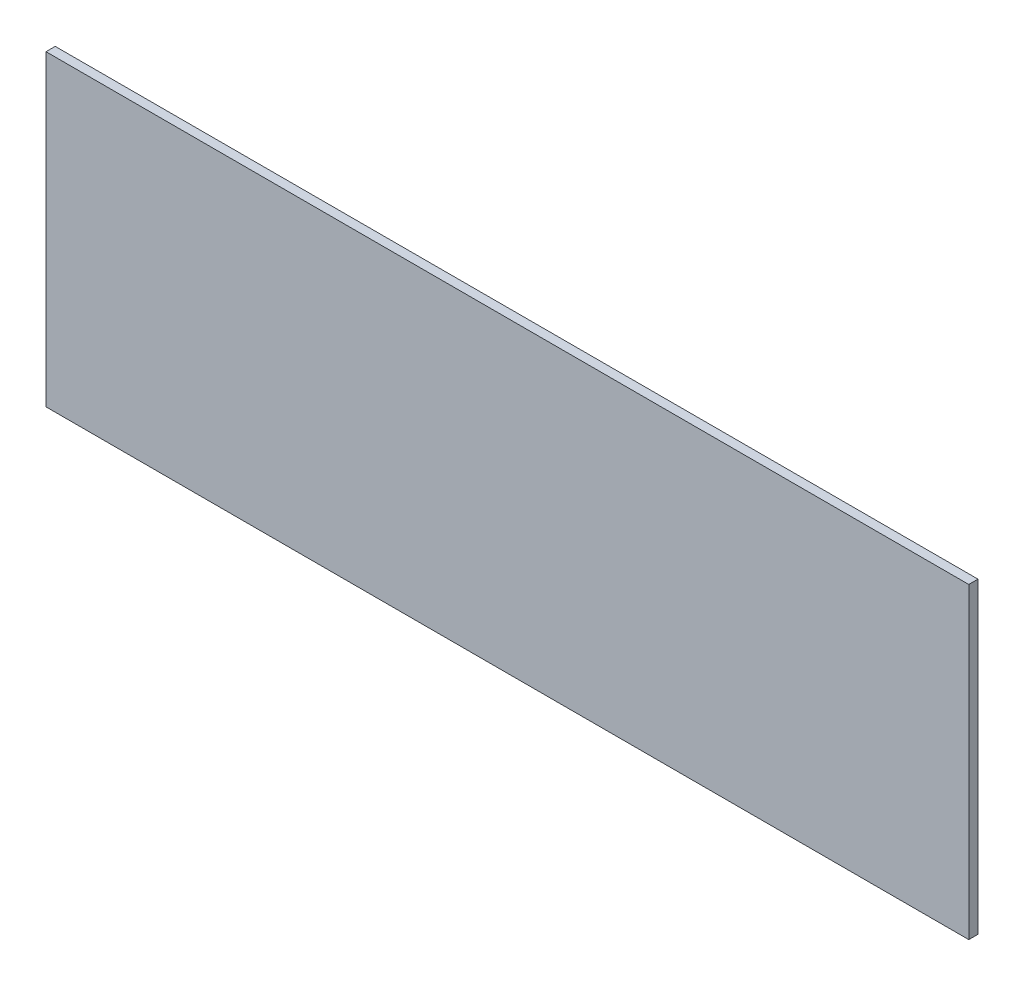
ISO-10303-21;
HEADER;
FILE_DESCRIPTION(('STEP AP214'),'2;1');
FILE_NAME('part.step','',(''),(''),'','','');
FILE_SCHEMA(('AUTOMOTIVE_DESIGN { 1 0 10303 214 1 1 1 1 }'));
ENDSEC;
DATA;
#1=APPLICATION_CONTEXT('core data for automotive mechanical design processes');
#2=APPLICATION_PROTOCOL_DEFINITION('international standard','automotive_design',2000,#1);
#3=PRODUCT_CONTEXT('',#1,'mechanical');
#4=PRODUCT('Part','Part','',(#3));
#5=PRODUCT_RELATED_PRODUCT_CATEGORY('part','',(#4));
#6=PRODUCT_DEFINITION_FORMATION('','',#4);
#7=PRODUCT_DEFINITION_CONTEXT('part definition',#1,'design');
#8=PRODUCT_DEFINITION('design','',#6,#7);
#9=PRODUCT_DEFINITION_SHAPE('','',#8);
#10=(LENGTH_UNIT() NAMED_UNIT(*) SI_UNIT(.MILLI.,.METRE.));
#11=(NAMED_UNIT(*) PLANE_ANGLE_UNIT() SI_UNIT($,.RADIAN.));
#12=(NAMED_UNIT(*) SI_UNIT($,.STERADIAN.) SOLID_ANGLE_UNIT());
#13=UNCERTAINTY_MEASURE_WITH_UNIT(LENGTH_MEASURE(1.E-05),#10,'distance_accuracy_value','');
#14=(GEOMETRIC_REPRESENTATION_CONTEXT(3) GLOBAL_UNCERTAINTY_ASSIGNED_CONTEXT((#13)) GLOBAL_UNIT_ASSIGNED_CONTEXT((#10,
#11,#12)) REPRESENTATION_CONTEXT('',''));
#15=CARTESIAN_POINT('',(0.,0.,0.));
#16=DIRECTION('',(0.,0.,1.));
#17=DIRECTION('',(1.,0.,0.));
#18=AXIS2_PLACEMENT_3D('',#15,#16,#17);
#19=CARTESIAN_POINT('',(0.,0.,3.));
#20=DIRECTION('',(1.,0.,0.));
#21=DIRECTION('',(0.,0.,-1.));
#22=AXIS2_PLACEMENT_3D('',#19,#20,#21);
#23=PLANE('',#22);
#24=DIRECTION('',(0.,-1.,0.));
#25=VECTOR('',#24,1.);
#26=CARTESIAN_POINT('',(0.,0.,0.));
#27=LINE('',#26,#25);
#28=CARTESIAN_POINT('',(0.,100.,0.));
#29=VERTEX_POINT('',#28);
#30=CARTESIAN_POINT('',(0.,0.,0.));
#31=VERTEX_POINT('',#30);
#32=EDGE_CURVE('E102',#29,#31,#27,.T.);
#33=ORIENTED_EDGE('',*,*,#32,.T.);
#34=DIRECTION('',(0.,0.,-1.));
#35=VECTOR('',#34,1.);
#36=CARTESIAN_POINT('',(0.,0.,3.));
#37=LINE('',#36,#35);
#38=CARTESIAN_POINT('',(0.,0.,3.));
#39=VERTEX_POINT('',#38);
#40=EDGE_CURVE('E11',#39,#31,#37,.T.);
#41=ORIENTED_EDGE('',*,*,#40,.F.);
#42=DIRECTION('',(0.,-1.,0.));
#43=VECTOR('',#42,1.);
#44=CARTESIAN_POINT('',(0.,0.,3.));
#45=LINE('',#44,#43);
#46=CARTESIAN_POINT('',(0.,100.,3.));
#47=VERTEX_POINT('',#46);
#48=EDGE_CURVE('E90',#47,#39,#45,.T.);
#49=ORIENTED_EDGE('',*,*,#48,.F.);
#50=DIRECTION('',(0.,0.,-1.));
#51=VECTOR('',#50,1.);
#52=CARTESIAN_POINT('',(0.,100.,3.));
#53=LINE('',#52,#51);
#54=EDGE_CURVE('E98',#47,#29,#53,.T.);
#55=ORIENTED_EDGE('',*,*,#54,.T.);
#56=EDGE_LOOP('',(#33,#41,#49,#55));
#57=FACE_BOUND('',#56,.T.);
#58=ADVANCED_FACE('F39',(#57),#23,.F.);
#59=CARTESIAN_POINT('',(0.,0.,3.));
#60=DIRECTION('',(0.,1.,0.));
#61=DIRECTION('',(0.,0.,1.));
#62=AXIS2_PLACEMENT_3D('',#59,#60,#61);
#63=PLANE('',#62);
#64=DIRECTION('',(1.,0.,0.));
#65=VECTOR('',#64,1.);
#66=CARTESIAN_POINT('',(0.,0.,0.));
#67=LINE('',#66,#65);
#68=CARTESIAN_POINT('',(300.,0.,0.));
#69=VERTEX_POINT('',#68);
#70=EDGE_CURVE('E94',#31,#69,#67,.T.);
#71=ORIENTED_EDGE('',*,*,#70,.T.);
#72=DIRECTION('',(0.,0.,-1.));
#73=VECTOR('',#72,1.);
#74=CARTESIAN_POINT('',(300.,0.,3.));
#75=LINE('',#74,#73);
#76=CARTESIAN_POINT('',(300.,0.,3.));
#77=VERTEX_POINT('',#76);
#78=EDGE_CURVE('E47',#77,#69,#75,.T.);
#79=ORIENTED_EDGE('',*,*,#78,.F.);
#80=DIRECTION('',(1.,0.,0.));
#81=VECTOR('',#80,1.);
#82=CARTESIAN_POINT('',(0.,0.,3.));
#83=LINE('',#82,#81);
#84=EDGE_CURVE('E85',#39,#77,#83,.T.);
#85=ORIENTED_EDGE('',*,*,#84,.F.);
#86=ORIENTED_EDGE('',*,*,#40,.T.);
#87=EDGE_LOOP('',(#71,#79,#85,#86));
#88=FACE_BOUND('',#87,.T.);
#89=ADVANCED_FACE('F93',(#88),#63,.F.);
#90=CARTESIAN_POINT('',(300.,0.,3.));
#91=DIRECTION('',(-1.,0.,0.));
#92=DIRECTION('',(0.,0.,1.));
#93=AXIS2_PLACEMENT_3D('',#90,#91,#92);
#94=PLANE('',#93);
#95=DIRECTION('',(0.,1.,0.));
#96=VECTOR('',#95,1.);
#97=CARTESIAN_POINT('',(300.,0.,0.));
#98=LINE('',#97,#96);
#99=CARTESIAN_POINT('',(300.,100.,0.));
#100=VERTEX_POINT('',#99);
#101=EDGE_CURVE('E72',#69,#100,#98,.T.);
#102=ORIENTED_EDGE('',*,*,#101,.T.);
#103=DIRECTION('',(0.,0.,-1.));
#104=VECTOR('',#103,1.);
#105=CARTESIAN_POINT('',(300.,100.,3.));
#106=LINE('',#105,#104);
#107=CARTESIAN_POINT('',(300.,100.,3.));
#108=VERTEX_POINT('',#107);
#109=EDGE_CURVE('E95',#108,#100,#106,.T.);
#110=ORIENTED_EDGE('',*,*,#109,.F.);
#111=DIRECTION('',(0.,1.,0.));
#112=VECTOR('',#111,1.);
#113=CARTESIAN_POINT('',(300.,0.,3.));
#114=LINE('',#113,#112);
#115=EDGE_CURVE('E88',#77,#108,#114,.T.);
#116=ORIENTED_EDGE('',*,*,#115,.F.);
#117=ORIENTED_EDGE('',*,*,#78,.T.);
#118=EDGE_LOOP('',(#102,#110,#116,#117));
#119=FACE_BOUND('',#118,.T.);
#120=ADVANCED_FACE('F96',(#119),#94,.F.);
#121=CARTESIAN_POINT('',(0.,100.,3.));
#122=DIRECTION('',(0.,-1.,0.));
#123=DIRECTION('',(0.,0.,-1.));
#124=AXIS2_PLACEMENT_3D('',#121,#122,#123);
#125=PLANE('',#124);
#126=DIRECTION('',(-1.,0.,0.));
#127=VECTOR('',#126,1.);
#128=CARTESIAN_POINT('',(0.,100.,0.));
#129=LINE('',#128,#127);
#130=EDGE_CURVE('E78',#100,#29,#129,.T.);
#131=ORIENTED_EDGE('',*,*,#130,.T.);
#132=ORIENTED_EDGE('',*,*,#54,.F.);
#133=DIRECTION('',(-1.,0.,0.));
#134=VECTOR('',#133,1.);
#135=CARTESIAN_POINT('',(0.,100.,3.));
#136=LINE('',#135,#134);
#137=EDGE_CURVE('E55',#108,#47,#136,.T.);
#138=ORIENTED_EDGE('',*,*,#137,.F.);
#139=ORIENTED_EDGE('',*,*,#109,.T.);
#140=EDGE_LOOP('',(#131,#132,#138,#139));
#141=FACE_BOUND('',#140,.T.);
#142=ADVANCED_FACE('F109',(#141),#125,.F.);
#143=CARTESIAN_POINT('',(0.,0.,3.));
#144=DIRECTION('',(0.,0.,-1.));
#145=DIRECTION('',(-1.,0.,0.));
#146=AXIS2_PLACEMENT_3D('',#143,#144,#145);
#147=PLANE('',#146);
#148=ORIENTED_EDGE('',*,*,#48,.T.);
#149=ORIENTED_EDGE('',*,*,#84,.T.);
#150=ORIENTED_EDGE('',*,*,#115,.T.);
#151=ORIENTED_EDGE('',*,*,#137,.T.);
#152=EDGE_LOOP('',(#148,#149,#150,#151));
#153=FACE_BOUND('',#152,.T.);
#154=ADVANCED_FACE('F86',(#153),#147,.F.);
#155=CARTESIAN_POINT('',(0.,0.,0.));
#156=DIRECTION('',(0.,0.,-1.));
#157=DIRECTION('',(-1.,0.,0.));
#158=AXIS2_PLACEMENT_3D('',#155,#156,#157);
#159=PLANE('',#158);
#160=ORIENTED_EDGE('',*,*,#32,.F.);
#161=ORIENTED_EDGE('',*,*,#130,.F.);
#162=ORIENTED_EDGE('',*,*,#101,.F.);
#163=ORIENTED_EDGE('',*,*,#70,.F.);
#164=EDGE_LOOP('',(#160,#161,#162,#163));
#165=FACE_BOUND('',#164,.T.);
#166=ADVANCED_FACE('F112',(#165),#159,.T.);
#167=CLOSED_SHELL('',(#58,#89,#120,#142,#154,#166));
#168=MANIFOLD_SOLID_BREP('B2',#167);
#169=ADVANCED_BREP_SHAPE_REPRESENTATION('',(#18,#168),#14);
#170=SHAPE_DEFINITION_REPRESENTATION(#9,#169);
ENDSEC;
END-ISO-10303-21;
